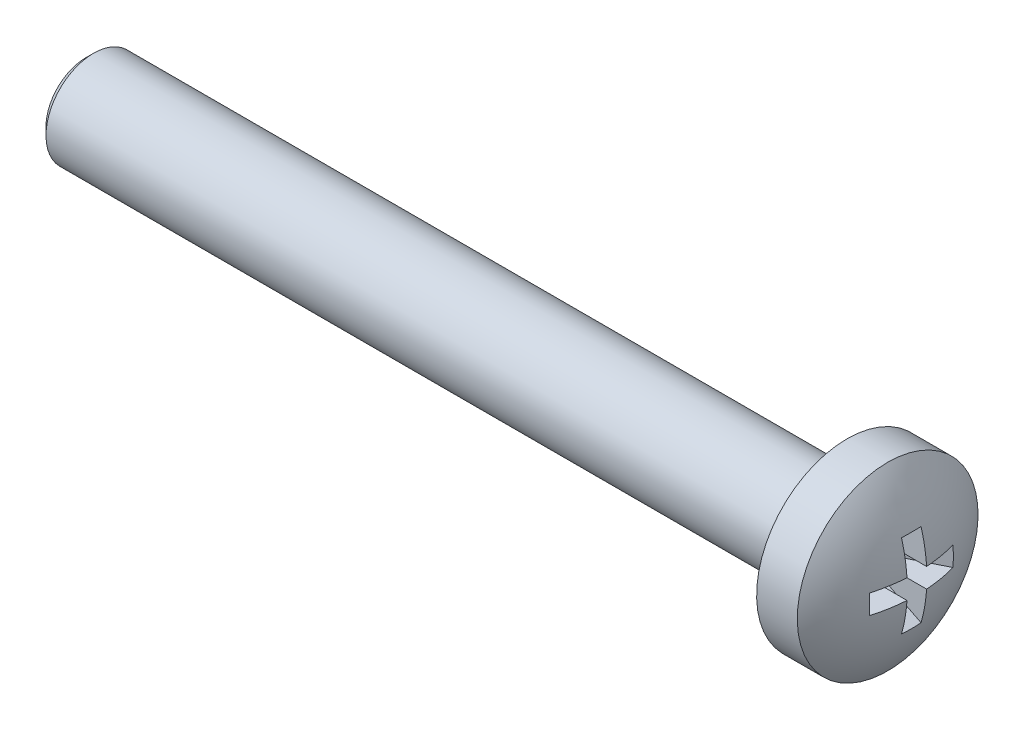
ISO-10303-21;
HEADER;
FILE_DESCRIPTION(('STEP AP214'),'2;1');
FILE_NAME('part.step','',(''),(''),'','','');
FILE_SCHEMA(('AUTOMOTIVE_DESIGN { 1 0 10303 214 1 1 1 1 }'));
ENDSEC;
DATA;
#1=APPLICATION_CONTEXT('core data for automotive mechanical design processes');
#2=APPLICATION_PROTOCOL_DEFINITION('international standard','automotive_design',2000,#1);
#3=PRODUCT_CONTEXT('',#1,'mechanical');
#4=PRODUCT('Part','Part','',(#3));
#5=PRODUCT_RELATED_PRODUCT_CATEGORY('part','',(#4));
#6=PRODUCT_DEFINITION_FORMATION('','',#4);
#7=PRODUCT_DEFINITION_CONTEXT('part definition',#1,'design');
#8=PRODUCT_DEFINITION('design','',#6,#7);
#9=PRODUCT_DEFINITION_SHAPE('','',#8);
#10=(LENGTH_UNIT() NAMED_UNIT(*) SI_UNIT(.MILLI.,.METRE.));
#11=(NAMED_UNIT(*) PLANE_ANGLE_UNIT() SI_UNIT($,.RADIAN.));
#12=(NAMED_UNIT(*) SI_UNIT($,.STERADIAN.) SOLID_ANGLE_UNIT());
#13=UNCERTAINTY_MEASURE_WITH_UNIT(LENGTH_MEASURE(1.E-05),#10,'distance_accuracy_value','');
#14=(GEOMETRIC_REPRESENTATION_CONTEXT(3) GLOBAL_UNCERTAINTY_ASSIGNED_CONTEXT((#13)) GLOBAL_UNIT_ASSIGNED_CONTEXT((#10,
#11,#12)) REPRESENTATION_CONTEXT('',''));
#15=CARTESIAN_POINT('',(0.,0.,0.));
#16=DIRECTION('',(0.,0.,1.));
#17=DIRECTION('',(1.,0.,0.));
#18=AXIS2_PLACEMENT_3D('',#15,#16,#17);
#19=CARTESIAN_POINT('',(-8.00000000000001,0.,0.));
#20=DIRECTION('',(0.999999999999983,0.,0.));
#21=DIRECTION('',(0.,0.999999999999994,0.));
#22=AXIS2_PLACEMENT_3D('',#19,#20,#21);
#23=SPHERICAL_SURFACE('',#22,8.);
#24=CARTESIAN_POINT('',(-7.34565681691368,-1.55431223447522E-12,-1.31240938798616));
#25=DIRECTION('',(0.446197813109793,0.,-0.894934361602041));
#26=DIRECTION('',(-0.894934361602008,0.,-0.446197813109825));
#27=AXIS2_PLACEMENT_3D('',#24,#25,#26);
#28=CIRCLE('',#27,7.86444000530718);
#29=CARTESIAN_POINT('',(-0.322606080628729,0.515000000000931,2.18915454155089));
#30=VERTEX_POINT('',#29);
#31=CARTESIAN_POINT('',(-0.322606080628729,-0.515000000000265,2.18915454155155));
#32=VERTEX_POINT('',#31);
#33=EDGE_CURVE('E230',#30,#32,#28,.T.);
#34=ORIENTED_EDGE('',*,*,#33,.F.);
#35=CARTESIAN_POINT('',(-8.00000000000001,0.514999999998489,-1.33226762955019E-12));
#36=DIRECTION('',(0.,-0.999999999999994,0.));
#37=DIRECTION('',(0.,0.,-1.00000000000002));
#38=AXIS2_PLACEMENT_3D('',#35,#36,#37);
#39=CIRCLE('',#38,7.98340622792051);
#40=CARTESIAN_POINT('',(-0.0332221067735894,0.514999999998544,0.514999999996046));
#41=VERTEX_POINT('',#40);
#42=EDGE_CURVE('E136',#30,#41,#39,.F.);
#43=ORIENTED_EDGE('',*,*,#42,.T.);
#44=CARTESIAN_POINT('',(-8.00000000000001,0.,0.514999999994936));
#45=DIRECTION('',(0.,0.,1.00000000000002));
#46=DIRECTION('',(0.,-0.999999999999994,0.));
#47=AXIS2_PLACEMENT_3D('',#44,#45,#46);
#48=CIRCLE('',#47,7.98340622792051);
#49=CARTESIAN_POINT('',(-0.322606080628729,2.18915454155083,0.51499999999649));
#50=VERTEX_POINT('',#49);
#51=EDGE_CURVE('E168',#50,#41,#48,.F.);
#52=ORIENTED_EDGE('',*,*,#51,.F.);
#53=CARTESIAN_POINT('',(-7.34565681691368,-1.31240938798682,-1.77635683940025E-12));
#54=DIRECTION('',(0.446197813109805,-0.894934361602021,0.));
#55=DIRECTION('',(0.894934361602008,0.446197813109806,0.));
#56=AXIS2_PLACEMENT_3D('',#53,#54,#55);
#57=CIRCLE('',#56,7.86444000530718);
#58=CARTESIAN_POINT('',(-0.322606080628729,2.18915454155189,-0.51500000000293));
#59=VERTEX_POINT('',#58);
#60=EDGE_CURVE('E165',#50,#59,#57,.F.);
#61=ORIENTED_EDGE('',*,*,#60,.T.);
#62=CARTESIAN_POINT('',(-8.00000000000001,0.,-0.515000000003596));
#63=DIRECTION('',(0.,0.,1.00000000000002));
#64=DIRECTION('',(0.,-0.999999999999994,0.));
#65=AXIS2_PLACEMENT_3D('',#62,#63,#64);
#66=CIRCLE('',#65,7.98340622792051);
#67=CARTESIAN_POINT('',(-0.0332221067735894,0.514999999998489,-0.514999999999821));
#68=VERTEX_POINT('',#67);
#69=EDGE_CURVE('E169',#59,#68,#66,.F.);
#70=ORIENTED_EDGE('',*,*,#69,.T.);
#71=CARTESIAN_POINT('',(-8.00000000000001,0.514999999998489,-1.33226762955019E-12));
#72=DIRECTION('',(0.,-0.999999999999994,0.));
#73=DIRECTION('',(0.,0.,-1.00000000000002));
#74=AXIS2_PLACEMENT_3D('',#71,#72,#73);
#75=CIRCLE('',#74,7.98340622792051);
#76=CARTESIAN_POINT('',(-0.322606080628729,0.5149999999991,-2.18915454155399));
#77=VERTEX_POINT('',#76);
#78=EDGE_CURVE('E223',#68,#77,#75,.F.);
#79=ORIENTED_EDGE('',*,*,#78,.T.);
#80=CARTESIAN_POINT('',(-7.34565681691368,-8.88178419700125E-13,1.31240938798483));
#81=DIRECTION('',(0.44619781310981,0.,0.894934361602047));
#82=DIRECTION('',(0.894934361602008,0.,-0.446197813109812));
#83=AXIS2_PLACEMENT_3D('',#80,#81,#82);
#84=CIRCLE('',#83,7.86444000530718);
#85=CARTESIAN_POINT('',(-0.322606080628729,-0.514999999999599,-2.18915454155533));
#86=VERTEX_POINT('',#85);
#87=EDGE_CURVE('E222',#77,#86,#84,.F.);
#88=ORIENTED_EDGE('',*,*,#87,.T.);
#89=CARTESIAN_POINT('',(-8.00000000000001,-0.515000000000099,-1.33226762955019E-12));
#90=DIRECTION('',(0.,-0.999999999999994,0.));
#91=DIRECTION('',(0.,0.,-1.00000000000002));
#92=AXIS2_PLACEMENT_3D('',#89,#90,#91);
#93=CIRCLE('',#92,7.98340622792051);
#94=CARTESIAN_POINT('',(-0.0332221067735894,-0.51499999999971,-0.515000000004262));
#95=VERTEX_POINT('',#94);
#96=EDGE_CURVE('E220',#95,#86,#93,.F.);
#97=ORIENTED_EDGE('',*,*,#96,.F.);
#98=CARTESIAN_POINT('',(-8.00000000000001,0.,-0.515000000003596));
#99=DIRECTION('',(0.,0.,1.00000000000002));
#100=DIRECTION('',(0.,-0.999999999999994,0.));
#101=AXIS2_PLACEMENT_3D('',#98,#99,#100);
#102=CIRCLE('',#101,7.98340622792051);
#103=CARTESIAN_POINT('',(-0.322606080628729,-2.18915454155244,-0.515000000000043));
#104=VERTEX_POINT('',#103);
#105=EDGE_CURVE('E179',#95,#104,#102,.F.);
#106=ORIENTED_EDGE('',*,*,#105,.T.);
#107=CARTESIAN_POINT('',(-7.34565681691368,1.31240938798471,-1.55431223447522E-12));
#108=DIRECTION('',(0.446197813109797,0.894934361602021,0.));
#109=DIRECTION('',(-0.894934361602008,0.446197813109809,0.));
#110=AXIS2_PLACEMENT_3D('',#107,#108,#109);
#111=CIRCLE('',#110,7.86444000530718);
#112=CARTESIAN_POINT('',(-0.322606080628729,-2.18915454155233,0.514999999996713));
#113=VERTEX_POINT('',#112);
#114=EDGE_CURVE('E176',#113,#104,#111,.T.);
#115=ORIENTED_EDGE('',*,*,#114,.F.);
#116=CARTESIAN_POINT('',(-8.00000000000001,0.,0.514999999994936));
#117=DIRECTION('',(0.,0.,1.00000000000002));
#118=DIRECTION('',(0.,-0.999999999999994,0.));
#119=AXIS2_PLACEMENT_3D('',#116,#117,#118);
#120=CIRCLE('',#119,7.98340622792051);
#121=CARTESIAN_POINT('',(-0.0332221067735894,-0.514999999999433,0.514999999997601));
#122=VERTEX_POINT('',#121);
#123=EDGE_CURVE('E180',#122,#113,#120,.F.);
#124=ORIENTED_EDGE('',*,*,#123,.F.);
#125=CARTESIAN_POINT('',(-8.00000000000001,-0.515000000000099,-1.33226762955019E-12));
#126=DIRECTION('',(0.,-0.999999999999994,0.));
#127=DIRECTION('',(0.,0.,-1.00000000000002));
#128=AXIS2_PLACEMENT_3D('',#125,#126,#127);
#129=CIRCLE('',#128,7.98340622792051);
#130=EDGE_CURVE('E215',#32,#122,#129,.F.);
#131=ORIENTED_EDGE('',*,*,#130,.F.);
#132=EDGE_LOOP('',(#34,#43,#52,#61,#70,#79,#88,#97,#106,#115,#124,#131));
#133=FACE_BOUND('',#132,.T.);
#134=CARTESIAN_POINT('',(-1.5628034052082,0.,0.));
#135=DIRECTION('',(0.999999999999983,0.,0.));
#136=DIRECTION('',(0.,0.999999999999994,0.));
#137=AXIS2_PLACEMENT_3D('',#134,#135,#136);
#138=CIRCLE('',#137,4.75);
#139=CARTESIAN_POINT('',(-1.56280340520819,4.74999999999998,0.));
#140=VERTEX_POINT('',#139);
#141=EDGE_CURVE('E140',#140,#140,#138,.T.);
#142=ORIENTED_EDGE('',*,*,#141,.T.);
#143=EDGE_LOOP('',(#142));
#144=FACE_BOUND('',#143,.T.);
#145=ADVANCED_FACE('F38',(#133,#144),#23,.T.);
#146=CARTESIAN_POINT('',(-43.7000000000001,0.,0.));
#147=DIRECTION('',(-0.999999999999983,0.,0.));
#148=DIRECTION('',(0.,-0.999999999999994,0.));
#149=AXIS2_PLACEMENT_3D('',#146,#147,#148);
#150=PLANE('',#149);
#151=CARTESIAN_POINT('',(-43.7000000000001,0.,0.));
#152=DIRECTION('',(-0.999999999999983,0.,0.));
#153=DIRECTION('',(0.,-0.999999999999994,0.));
#154=AXIS2_PLACEMENT_3D('',#151,#152,#153);
#155=CIRCLE('',#154,2.10000000000002);
#156=CARTESIAN_POINT('',(-43.7000000000001,2.09999999999982,0.));
#157=VERTEX_POINT('',#156);
#158=EDGE_CURVE('E11',#157,#157,#155,.T.);
#159=ORIENTED_EDGE('',*,*,#158,.T.);
#160=EDGE_LOOP('',(#159));
#161=FACE_BOUND('',#160,.T.);
#162=ADVANCED_FACE('F282',(#161),#150,.T.);
#163=CARTESIAN_POINT('',(0.,0.,0.));
#164=DIRECTION('',(0.999999999999983,0.,0.));
#165=DIRECTION('',(0.,0.999999999999994,0.));
#166=AXIS2_PLACEMENT_3D('',#163,#164,#165);
#167=CYLINDRICAL_SURFACE('',#166,2.5);
#168=CARTESIAN_POINT('',(-43.2999999999999,0.,0.));
#169=DIRECTION('',(-0.999999999999983,0.,0.));
#170=DIRECTION('',(0.,-0.999999999999994,0.));
#171=AXIS2_PLACEMENT_3D('',#168,#169,#170);
#172=CIRCLE('',#171,2.5);
#173=CARTESIAN_POINT('',(-43.2999999999999,2.5000000000001,-2.81843633553392E-13));
#174=VERTEX_POINT('',#173);
#175=EDGE_CURVE('E48',#174,#174,#172,.F.);
#176=CARTESIAN_POINT('',(-3.70000000000004,0.,0.));
#177=DIRECTION('',(0.999999999999983,0.,0.));
#178=DIRECTION('',(0.,0.999999999999994,0.));
#179=AXIS2_PLACEMENT_3D('',#176,#177,#178);
#180=CIRCLE('',#179,2.5);
#181=CARTESIAN_POINT('',(-3.70000000000003,2.49999999999999,0.));
#182=VERTEX_POINT('',#181);
#183=EDGE_CURVE('E212',#182,#182,#180,.T.);
#184=CARTESIAN_POINT('',(-43.2999999999999,2.5000000000001,-2.81843633553392E-13));
#185=CARTESIAN_POINT('',(-42.8874999999999,2.5000000000001,-2.78908761286407E-13));
#186=CARTESIAN_POINT('',(-42.4749999999999,2.5000000000001,-2.75973889019423E-13));
#187=CARTESIAN_POINT('',(-41.6499999999999,2.5000000000001,-2.70104144485453E-13));
#188=CARTESIAN_POINT('',(-41.2374999999999,2.50000000000009,-2.67169272218468E-13));
#189=CARTESIAN_POINT('',(-40.4124999999999,2.50000000000009,-2.61299527684499E-13));
#190=CARTESIAN_POINT('',(-39.9999999999999,2.50000000000009,-2.58364655417514E-13));
#191=CARTESIAN_POINT('',(-39.1749999999999,2.50000000000009,-2.52494910883544E-13));
#192=CARTESIAN_POINT('',(-38.7624999999999,2.50000000000009,-2.49560038616559E-13));
#193=CARTESIAN_POINT('',(-37.9374999999999,2.50000000000009,-2.4369029408259E-13));
#194=CARTESIAN_POINT('',(-37.5249999999999,2.50000000000008,-2.40755421815605E-13));
#195=CARTESIAN_POINT('',(-36.6999999999999,2.50000000000008,-2.34885677281635E-13));
#196=CARTESIAN_POINT('',(-36.2874999999999,2.50000000000008,-2.31950805014651E-13));
#197=CARTESIAN_POINT('',(-35.4624999999999,2.50000000000008,-2.26081060480681E-13));
#198=CARTESIAN_POINT('',(-35.0499999999999,2.50000000000008,-2.23146188213696E-13));
#199=CARTESIAN_POINT('',(-34.2249999999999,2.50000000000008,-2.17276443679727E-13));
#200=CARTESIAN_POINT('',(-33.8124999999999,2.50000000000007,-2.14341571412742E-13));
#201=CARTESIAN_POINT('',(-32.9874999999999,2.50000000000007,-2.08471826878772E-13));
#202=CARTESIAN_POINT('',(-32.5749999999999,2.50000000000007,-2.05536954611787E-13));
#203=CARTESIAN_POINT('',(-31.7499999999999,2.50000000000007,-1.99667210077818E-13));
#204=CARTESIAN_POINT('',(-31.3374999999999,2.50000000000007,-1.96732337810833E-13));
#205=CARTESIAN_POINT('',(-30.5124999999999,2.50000000000007,-1.90862593276864E-13));
#206=CARTESIAN_POINT('',(-30.0999999999999,2.50000000000006,-1.87927721009879E-13));
#207=CARTESIAN_POINT('',(-29.2749999999999,2.50000000000006,-1.82057976475909E-13));
#208=CARTESIAN_POINT('',(-28.8624999999999,2.50000000000006,-1.79123104208924E-13));
#209=CARTESIAN_POINT('',(-28.0374999999999,2.50000000000006,-1.73253359674955E-13));
#210=CARTESIAN_POINT('',(-27.625,2.50000000000006,-1.7031848740797E-13));
#211=CARTESIAN_POINT('',(-26.8,2.50000000000006,-1.64448742874E-13));
#212=CARTESIAN_POINT('',(-26.3875,2.50000000000005,-1.61513870607016E-13));
#213=CARTESIAN_POINT('',(-25.5625,2.50000000000005,-1.55644126073046E-13));
#214=CARTESIAN_POINT('',(-25.15,2.50000000000005,-1.52709253806061E-13));
#215=CARTESIAN_POINT('',(-24.325,2.50000000000005,-1.46839509272092E-13));
#216=CARTESIAN_POINT('',(-23.9125,2.50000000000005,-1.43904637005107E-13));
#217=CARTESIAN_POINT('',(-23.0875,2.50000000000005,-1.38034892471137E-13));
#218=CARTESIAN_POINT('',(-22.675,2.50000000000005,-1.35100020204153E-13));
#219=CARTESIAN_POINT('',(-21.85,2.50000000000004,-1.29230275670183E-13));
#220=CARTESIAN_POINT('',(-21.4375,2.50000000000004,-1.26295403403198E-13));
#221=CARTESIAN_POINT('',(-20.6125,2.50000000000004,-1.20425658869229E-13));
#222=CARTESIAN_POINT('',(-20.2,2.50000000000004,-1.17490786602244E-13));
#223=CARTESIAN_POINT('',(-19.375,2.50000000000004,-1.11621042068274E-13));
#224=CARTESIAN_POINT('',(-18.9625,2.50000000000004,-1.08686169801289E-13));
#225=CARTESIAN_POINT('',(-18.1375,2.50000000000003,-1.0281642526732E-13));
#226=CARTESIAN_POINT('',(-17.725,2.50000000000003,0.));
#227=CARTESIAN_POINT('',(-16.9,2.50000000000003,0.));
#228=CARTESIAN_POINT('',(-16.4875,2.50000000000003,0.));
#229=CARTESIAN_POINT('',(-15.6625,2.50000000000003,0.));
#230=CARTESIAN_POINT('',(-15.25,2.50000000000003,0.));
#231=CARTESIAN_POINT('',(-14.425,2.50000000000002,0.));
#232=CARTESIAN_POINT('',(-14.0125,2.50000000000002,0.));
#233=CARTESIAN_POINT('',(-13.1875,2.50000000000002,0.));
#234=CARTESIAN_POINT('',(-12.775,2.50000000000002,0.));
#235=CARTESIAN_POINT('',(-11.95,2.50000000000002,0.));
#236=CARTESIAN_POINT('',(-11.5375,2.50000000000002,0.));
#237=CARTESIAN_POINT('',(-10.7125,2.50000000000001,0.));
#238=CARTESIAN_POINT('',(-10.3,2.50000000000001,0.));
#239=CARTESIAN_POINT('',(-9.47500000000001,2.50000000000001,0.));
#240=CARTESIAN_POINT('',(-9.06250000000001,2.50000000000001,0.));
#241=CARTESIAN_POINT('',(-8.23750000000001,2.50000000000001,0.));
#242=CARTESIAN_POINT('',(-7.82500000000001,2.50000000000001,0.));
#243=CARTESIAN_POINT('',(-7.00000000000002,2.5,0.));
#244=CARTESIAN_POINT('',(-6.58750000000002,2.5,0.));
#245=CARTESIAN_POINT('',(-5.76250000000002,2.5,0.));
#246=CARTESIAN_POINT('',(-5.35000000000002,2.5,0.));
#247=CARTESIAN_POINT('',(-4.52500000000003,2.5,0.));
#248=CARTESIAN_POINT('',(-4.11250000000003,2.5,0.));
#249=CARTESIAN_POINT('',(-3.70000000000003,2.49999999999999,0.));
#250=B_SPLINE_CURVE_WITH_KNOTS('',3,(#184,#185,#186,#187,#188,#189,#190,#191,#192,#193,#194,
#195,#196,#197,#198,#199,#200,#201,#202,#203,#204,#205,#206,#207,#208,#209,#210,#211,#212,#213,
#214,#215,#216,#217,#218,#219,#220,#221,#222,#223,#224,#225,#226,#227,#228,#229,#230,#231,#232,
#233,#234,#235,#236,#237,#238,#239,#240,#241,#242,#243,#244,#245,#246,#247,#248,#249),
.UNSPECIFIED.,.F.,.F.,(4,2,2,2,2,2,2,2,2,2,2,2,2,2,2,2,2,2,2,2,2,2,2,2,2,2,2,2,2,2,2,2,4),(0.,
1.2375,2.47499999999999,3.71249999999999,4.94999999999998,6.18749999999997,7.42499999999997,
8.66249999999997,9.89999999999996,11.1375,12.375,13.6125,14.8499999999999,16.0874999999999,
17.3249999999999,18.5624999999999,19.7999999999999,21.0374999999999,22.2749999999999,
23.5124999999999,24.7499999999999,25.9874999999999,27.2249999999999,28.4624999999999,
29.6999999999999,30.9374999999999,32.1749999999999,33.4124999999999,34.6499999999999,
35.8874999999999,37.1249999999999,38.3624999999999,39.5999999999999),.UNSPECIFIED.);
#251=EDGE_CURVE('BSEAM287',#174,#182,#250,.T.);
#252=ORIENTED_EDGE('',*,*,#175,.T.);
#253=ORIENTED_EDGE('',*,*,#183,.F.);
#254=ORIENTED_EDGE('',*,*,#251,.T.);
#255=ORIENTED_EDGE('',*,*,#251,.F.);
#256=EDGE_LOOP('',(#252,#254,#253,#255));
#257=FACE_BOUND('',#256,.T.);
#258=ADVANCED_FACE('F287',(#257),#167,.T.);
#259=CARTESIAN_POINT('',(-3.70000000000004,2.49999999999834,-2.22044604925031E-13));
#260=DIRECTION('',(-0.999999999999983,0.,0.));
#261=DIRECTION('',(0.,-0.999999999999994,0.));
#262=AXIS2_PLACEMENT_3D('',#259,#260,#261);
#263=PLANE('',#262);
#264=ORIENTED_EDGE('',*,*,#183,.T.);
#265=EDGE_LOOP('',(#264));
#266=FACE_BOUND('',#265,.T.);
#267=CARTESIAN_POINT('',(-3.70000000000004,0.,0.));
#268=DIRECTION('',(0.999999999999983,0.,0.));
#269=DIRECTION('',(0.,0.999999999999994,0.));
#270=AXIS2_PLACEMENT_3D('',#267,#268,#269);
#271=CIRCLE('',#270,4.75);
#272=CARTESIAN_POINT('',(-3.70000000000002,4.74999999999998,0.));
#273=VERTEX_POINT('',#272);
#274=EDGE_CURVE('E209',#273,#273,#271,.T.);
#275=ORIENTED_EDGE('',*,*,#274,.F.);
#276=EDGE_LOOP('',(#275));
#277=FACE_BOUND('',#276,.T.);
#278=ADVANCED_FACE('F316',(#266,#277),#263,.T.);
#279=CARTESIAN_POINT('',(0.,0.,0.));
#280=DIRECTION('',(0.999999999999983,0.,0.));
#281=DIRECTION('',(0.,0.999999999999994,0.));
#282=AXIS2_PLACEMENT_3D('',#279,#280,#281);
#283=CYLINDRICAL_SURFACE('',#282,4.75);
#284=CARTESIAN_POINT('',(-3.70000000000002,4.74999999999998,0.));
#285=CARTESIAN_POINT('',(-3.67773753547094,4.74999999999998,0.));
#286=CARTESIAN_POINT('',(-3.65547507094186,4.74999999999998,0.));
#287=CARTESIAN_POINT('',(-3.6109501418837,4.74999999999998,0.));
#288=CARTESIAN_POINT('',(-3.58868767735462,4.74999999999998,0.));
#289=CARTESIAN_POINT('',(-3.54416274829645,4.74999999999998,0.));
#290=CARTESIAN_POINT('',(-3.52190028376737,4.74999999999998,0.));
#291=CARTESIAN_POINT('',(-3.47737535470921,4.74999999999998,0.));
#292=CARTESIAN_POINT('',(-3.45511289018013,4.74999999999998,0.));
#293=CARTESIAN_POINT('',(-3.41058796112196,4.74999999999998,0.));
#294=CARTESIAN_POINT('',(-3.38832549659288,4.74999999999998,0.));
#295=CARTESIAN_POINT('',(-3.34380056753472,4.74999999999998,0.));
#296=CARTESIAN_POINT('',(-3.32153810300564,4.74999999999998,0.));
#297=CARTESIAN_POINT('',(-3.27701317394747,4.74999999999998,0.));
#298=CARTESIAN_POINT('',(-3.25475070941839,4.74999999999998,0.));
#299=CARTESIAN_POINT('',(-3.21022578036023,4.74999999999998,0.));
#300=CARTESIAN_POINT('',(-3.18796331583115,4.74999999999998,0.));
#301=CARTESIAN_POINT('',(-3.14343838677298,4.74999999999998,0.));
#302=CARTESIAN_POINT('',(-3.1211759222439,4.74999999999998,0.));
#303=CARTESIAN_POINT('',(-3.07665099318574,4.74999999999998,0.));
#304=CARTESIAN_POINT('',(-3.05438852865666,4.74999999999998,0.));
#305=CARTESIAN_POINT('',(-3.00986359959849,4.74999999999998,0.));
#306=CARTESIAN_POINT('',(-2.98760113506941,4.74999999999998,0.));
#307=CARTESIAN_POINT('',(-2.94307620601125,4.74999999999998,0.));
#308=CARTESIAN_POINT('',(-2.92081374148217,4.74999999999998,0.));
#309=CARTESIAN_POINT('',(-2.876288812424,4.74999999999998,0.));
#310=CARTESIAN_POINT('',(-2.85402634789492,4.74999999999998,0.));
#311=CARTESIAN_POINT('',(-2.80950141883676,4.74999999999998,0.));
#312=CARTESIAN_POINT('',(-2.78723895430768,4.74999999999998,0.));
#313=CARTESIAN_POINT('',(-2.74271402524951,4.74999999999998,0.));
#314=CARTESIAN_POINT('',(-2.72045156072043,4.74999999999998,0.));
#315=CARTESIAN_POINT('',(-2.67592663166227,4.74999999999998,0.));
#316=CARTESIAN_POINT('',(-2.65366416713319,4.74999999999998,0.));
#317=CARTESIAN_POINT('',(-2.60913923807503,4.74999999999998,0.));
#318=CARTESIAN_POINT('',(-2.58687677354594,4.74999999999998,0.));
#319=CARTESIAN_POINT('',(-2.54235184448778,4.74999999999998,0.));
#320=CARTESIAN_POINT('',(-2.5200893799587,4.74999999999998,0.));
#321=CARTESIAN_POINT('',(-2.47556445090054,4.74999999999998,0.));
#322=CARTESIAN_POINT('',(-2.45330198637145,4.74999999999998,0.));
#323=CARTESIAN_POINT('',(-2.40877705731329,4.74999999999998,0.));
#324=CARTESIAN_POINT('',(-2.38651459278421,4.74999999999998,0.));
#325=CARTESIAN_POINT('',(-2.34198966372605,4.74999999999998,0.));
#326=CARTESIAN_POINT('',(-2.31972719919696,4.74999999999998,0.));
#327=CARTESIAN_POINT('',(-2.2752022701388,4.74999999999998,0.));
#328=CARTESIAN_POINT('',(-2.25293980560972,4.74999999999998,0.));
#329=CARTESIAN_POINT('',(-2.20841487655156,4.74999999999998,0.));
#330=CARTESIAN_POINT('',(-2.18615241202248,4.74999999999998,0.));
#331=CARTESIAN_POINT('',(-2.14162748296431,4.74999999999998,0.));
#332=CARTESIAN_POINT('',(-2.11936501843523,4.74999999999998,0.));
#333=CARTESIAN_POINT('',(-2.07484008937707,4.74999999999998,0.));
#334=CARTESIAN_POINT('',(-2.05257762484798,4.74999999999998,0.));
#335=CARTESIAN_POINT('',(-2.00805269578982,4.74999999999998,0.));
#336=CARTESIAN_POINT('',(-1.98579023126074,4.74999999999998,0.));
#337=CARTESIAN_POINT('',(-1.94126530220258,4.74999999999998,0.));
#338=CARTESIAN_POINT('',(-1.9190028376735,4.74999999999998,0.));
#339=CARTESIAN_POINT('',(-1.87447790861533,4.74999999999998,0.));
#340=CARTESIAN_POINT('',(-1.85221544408625,4.74999999999998,0.));
#341=CARTESIAN_POINT('',(-1.80769051502809,4.74999999999998,0.));
#342=CARTESIAN_POINT('',(-1.78542805049901,4.74999999999998,0.));
#343=CARTESIAN_POINT('',(-1.74090312144084,4.74999999999998,0.));
#344=CARTESIAN_POINT('',(-1.71864065691176,4.74999999999998,0.));
#345=CARTESIAN_POINT('',(-1.6741157278536,4.74999999999998,0.));
#346=CARTESIAN_POINT('',(-1.65185326332452,4.74999999999998,0.));
#347=CARTESIAN_POINT('',(-1.60732833426635,4.74999999999998,0.));
#348=CARTESIAN_POINT('',(-1.58506586973727,4.74999999999998,0.));
#349=CARTESIAN_POINT('',(-1.56280340520819,4.74999999999998,0.));
#350=B_SPLINE_CURVE_WITH_KNOTS('',3,(#284,#285,#286,#287,#288,#289,#290,#291,#292,#293,#294,
#295,#296,#297,#298,#299,#300,#301,#302,#303,#304,#305,#306,#307,#308,#309,#310,#311,#312,#313,
#314,#315,#316,#317,#318,#319,#320,#321,#322,#323,#324,#325,#326,#327,#328,#329,#330,#331,#332,
#333,#334,#335,#336,#337,#338,#339,#340,#341,#342,#343,#344,#345,#346,#347,#348,#349),
.UNSPECIFIED.,.F.,.F.,(4,2,2,2,2,2,2,2,2,2,2,2,2,2,2,2,2,2,2,2,2,2,2,2,2,2,2,2,2,2,2,2,4),(0.,
0.0667873935872448,0.13357478717449,0.200362180761735,0.267149574348979,0.333936967936224,
0.400724361523469,0.467511755110714,0.534299148697959,0.601086542285204,0.667873935872448,
0.734661329459693,0.801448723046938,0.868236116634183,0.935023510221428,1.00181090380867,
1.06859829739592,1.13538569098316,1.20217308457041,1.26896047815765,1.3357478717449,
1.40253526533214,1.46932265891939,1.53611005250663,1.60289744609388,1.66968483968112,
1.73647223326837,1.80325962685561,1.87004702044286,1.9368344140301,2.00362180761735,
2.07040920120459,2.13719659479184),.UNSPECIFIED.);
#351=EDGE_CURVE('BSEAM313',#273,#140,#350,.T.);
#352=ORIENTED_EDGE('',*,*,#274,.T.);
#353=ORIENTED_EDGE('',*,*,#141,.F.);
#354=ORIENTED_EDGE('',*,*,#351,.T.);
#355=ORIENTED_EDGE('',*,*,#351,.F.);
#356=EDGE_LOOP('',(#352,#354,#353,#355));
#357=FACE_BOUND('',#356,.T.);
#358=ADVANCED_FACE('F313',(#357),#283,.T.);
#359=CARTESIAN_POINT('',(0.,1.11022302462516E-13,2.3500000000003));
#360=DIRECTION('',(0.446197813109793,0.,-0.894934361602041));
#361=DIRECTION('',(-0.894934361602008,0.,-0.446197813109825));
#362=AXIS2_PLACEMENT_3D('',#359,#360,#361);
#363=PLANE('',#362);
#364=ORIENTED_EDGE('',*,*,#33,.T.);
#365=DIRECTION('',(-0.894934361602008,0.,-0.446197813109825));
#366=VECTOR('',#365,1.);
#367=CARTESIAN_POINT('',(0.,-0.515000000000598,2.34999999999719));
#368=LINE('',#367,#366);
#369=CARTESIAN_POINT('',(-2.73999999999996,-0.515000000000265,0.98388639393221));
#370=VERTEX_POINT('',#369);
#371=EDGE_CURVE('E57',#370,#32,#368,.F.);
#372=ORIENTED_EDGE('',*,*,#371,.F.);
#373=DIRECTION('',(0.,0.999999999999994,0.));
#374=VECTOR('',#373,1.);
#375=CARTESIAN_POINT('',(-2.73999999999996,-7.21644966006352E-13,0.983886393934652));
#376=LINE('',#375,#374);
#377=CARTESIAN_POINT('',(-2.73999999999996,0.514999999999932,0.983886393928435));
#378=VERTEX_POINT('',#377);
#379=EDGE_CURVE('E148',#378,#370,#376,.F.);
#380=ORIENTED_EDGE('',*,*,#379,.F.);
#381=DIRECTION('',(-0.894934361602008,0.,-0.446197813109825));
#382=VECTOR('',#381,1.);
#383=CARTESIAN_POINT('',(0.,0.515000000000487,2.34999999999652));
#384=LINE('',#383,#382);
#385=EDGE_CURVE('E129',#378,#30,#384,.F.);
#386=ORIENTED_EDGE('',*,*,#385,.T.);
#387=EDGE_LOOP('',(#364,#372,#380,#386));
#388=FACE_BOUND('',#387,.T.);
#389=ADVANCED_FACE('F40',(#388),#363,.T.);
#390=CARTESIAN_POINT('',(-2.73999999999996,0.514999999998489,-1.33226762955019E-12));
#391=DIRECTION('',(0.,-0.999999999999994,0.));
#392=DIRECTION('',(0.,0.,-1.00000000000002));
#393=AXIS2_PLACEMENT_3D('',#390,#391,#392);
#394=PLANE('',#393);
#395=ORIENTED_EDGE('',*,*,#385,.F.);
#396=DIRECTION('',(0.,0.,-1.00000000000002));
#397=VECTOR('',#396,1.);
#398=CARTESIAN_POINT('',(-2.73999999999996,0.514999999998489,-1.33226762955019E-12));
#399=LINE('',#398,#397);
#400=CARTESIAN_POINT('',(-2.73999999999996,0.514999999998544,0.514999999996046));
#401=VERTEX_POINT('',#400);
#402=EDGE_CURVE('E133',#378,#401,#399,.T.);
#403=ORIENTED_EDGE('',*,*,#402,.T.);
#404=DIRECTION('',(0.999999999999983,0.,0.));
#405=VECTOR('',#404,1.);
#406=CARTESIAN_POINT('',(-2.73999999999996,0.514999999998544,0.514999999996046));
#407=LINE('',#406,#405);
#408=EDGE_CURVE('E141',#401,#41,#407,.T.);
#409=ORIENTED_EDGE('',*,*,#408,.T.);
#410=ORIENTED_EDGE('',*,*,#42,.F.);
#411=EDGE_LOOP('',(#395,#403,#409,#410));
#412=FACE_BOUND('',#411,.T.);
#413=ADVANCED_FACE('F131',(#412),#394,.T.);
#414=CARTESIAN_POINT('',(-2.73999999999996,0.,0.514999999997157));
#415=DIRECTION('',(0.,0.,1.00000000000002));
#416=DIRECTION('',(0.,-0.999999999999994,0.));
#417=AXIS2_PLACEMENT_3D('',#414,#415,#416);
#418=PLANE('',#417);
#419=ORIENTED_EDGE('',*,*,#51,.T.);
#420=ORIENTED_EDGE('',*,*,#408,.F.);
#421=DIRECTION('',(0.,-0.999999999999994,0.));
#422=VECTOR('',#421,1.);
#423=CARTESIAN_POINT('',(-2.73999999999996,0.,0.514999999997157));
#424=LINE('',#423,#422);
#425=CARTESIAN_POINT('',(-2.73999999999996,0.983886393934152,0.514999999999599));
#426=VERTEX_POINT('',#425);
#427=EDGE_CURVE('E151',#426,#401,#424,.T.);
#428=ORIENTED_EDGE('',*,*,#427,.F.);
#429=DIRECTION('',(0.894934361602008,0.446197813109806,0.));
#430=VECTOR('',#429,1.);
#431=CARTESIAN_POINT('',(-3.13288330602379,0.788002003438537,0.514999999998933));
#432=LINE('',#431,#430);
#433=EDGE_CURVE('E161',#426,#50,#432,.T.);
#434=ORIENTED_EDGE('',*,*,#433,.T.);
#435=EDGE_LOOP('',(#419,#420,#428,#434));
#436=FACE_BOUND('',#435,.T.);
#437=ADVANCED_FACE('F272',(#436),#418,.F.);
#438=CARTESIAN_POINT('',(0.,2.34999999999946,-1.77635683940025E-12));
#439=DIRECTION('',(0.446197813109805,-0.894934361602021,0.));
#440=DIRECTION('',(0.894934361602008,0.446197813109806,0.));
#441=AXIS2_PLACEMENT_3D('',#438,#439,#440);
#442=PLANE('',#441);
#443=ORIENTED_EDGE('',*,*,#433,.F.);
#444=DIRECTION('',(0.,0.,-1.00000000000002));
#445=VECTOR('',#444,1.);
#446=CARTESIAN_POINT('',(-2.73999999999996,0.983886393931876,-4.44089209850063E-13));
#447=LINE('',#446,#445);
#448=CARTESIAN_POINT('',(-2.73999999999996,0.983886393933764,-0.515000000004484));
#449=VERTEX_POINT('',#448);
#450=EDGE_CURVE('E173',#426,#449,#447,.T.);
#451=ORIENTED_EDGE('',*,*,#450,.T.);
#452=DIRECTION('',(0.894934361602008,0.446197813109806,0.));
#453=VECTOR('',#452,1.);
#454=CARTESIAN_POINT('',(-3.13288330602379,0.788002003437871,-0.515000000002486));
#455=LINE('',#454,#453);
#456=EDGE_CURVE('E164',#449,#59,#455,.T.);
#457=ORIENTED_EDGE('',*,*,#456,.T.);
#458=ORIENTED_EDGE('',*,*,#60,.F.);
#459=EDGE_LOOP('',(#443,#451,#457,#458));
#460=FACE_BOUND('',#459,.T.);
#461=ADVANCED_FACE('F270',(#460),#442,.T.);
#462=CARTESIAN_POINT('',(-2.73999999999996,-4.44089209850063E-13,-0.515000000001153));
#463=DIRECTION('',(0.,0.,1.00000000000002));
#464=DIRECTION('',(0.,-0.999999999999994,0.));
#465=AXIS2_PLACEMENT_3D('',#462,#463,#464);
#466=PLANE('',#465);
#467=ORIENTED_EDGE('',*,*,#456,.F.);
#468=DIRECTION('',(0.,-0.999999999999994,0.));
#469=VECTOR('',#468,1.);
#470=CARTESIAN_POINT('',(-2.73999999999996,-4.44089209850063E-13,-0.515000000001153));
#471=LINE('',#470,#469);
#472=CARTESIAN_POINT('',(-2.73999999999996,0.514999999998489,-0.514999999999821));
#473=VERTEX_POINT('',#472);
#474=EDGE_CURVE('E175',#449,#473,#471,.T.);
#475=ORIENTED_EDGE('',*,*,#474,.T.);
#476=DIRECTION('',(0.999999999999983,0.,0.));
#477=VECTOR('',#476,1.);
#478=CARTESIAN_POINT('',(-2.73999999999996,0.514999999998489,-0.514999999999821));
#479=LINE('',#478,#477);
#480=EDGE_CURVE('E172',#473,#68,#479,.T.);
#481=ORIENTED_EDGE('',*,*,#480,.T.);
#482=ORIENTED_EDGE('',*,*,#69,.F.);
#483=EDGE_LOOP('',(#467,#475,#481,#482));
#484=FACE_BOUND('',#483,.T.);
#485=ADVANCED_FACE('F267',(#484),#466,.T.);
#486=CARTESIAN_POINT('',(-2.73999999999996,0.514999999998489,-1.33226762955019E-12));
#487=DIRECTION('',(0.,-0.999999999999994,0.));
#488=DIRECTION('',(0.,0.,-1.00000000000002));
#489=AXIS2_PLACEMENT_3D('',#486,#487,#488);
#490=PLANE('',#489);
#491=ORIENTED_EDGE('',*,*,#480,.F.);
#492=DIRECTION('',(0.,0.,-1.00000000000002));
#493=VECTOR('',#492,1.);
#494=CARTESIAN_POINT('',(-2.73999999999996,0.514999999998489,-1.33226762955019E-12));
#495=LINE('',#494,#493);
#496=CARTESIAN_POINT('',(-2.73999999999996,0.514999999999599,-0.983886393935762));
#497=VERTEX_POINT('',#496);
#498=EDGE_CURVE('E195',#473,#497,#495,.T.);
#499=ORIENTED_EDGE('',*,*,#498,.T.);
#500=DIRECTION('',(0.894934361602008,0.,-0.446197813109812));
#501=VECTOR('',#500,1.);
#502=CARTESIAN_POINT('',(0.,0.514999999997545,-2.3500000000034));
#503=LINE('',#502,#501);
#504=EDGE_CURVE('E202',#497,#77,#503,.T.);
#505=ORIENTED_EDGE('',*,*,#504,.T.);
#506=ORIENTED_EDGE('',*,*,#78,.F.);
#507=EDGE_LOOP('',(#491,#499,#505,#506));
#508=FACE_BOUND('',#507,.T.);
#509=ADVANCED_FACE('F264',(#508),#490,.T.);
#510=CARTESIAN_POINT('',(0.,-1.0547118733939E-12,-2.34999999999985));
#511=DIRECTION('',(0.44619781310981,0.,0.894934361602047));
#512=DIRECTION('',(0.894934361602008,0.,-0.446197813109812));
#513=AXIS2_PLACEMENT_3D('',#510,#511,#512);
#514=PLANE('',#513);
#515=ORIENTED_EDGE('',*,*,#504,.F.);
#516=DIRECTION('',(0.,-0.999999999999994,0.));
#517=VECTOR('',#516,1.);
#518=CARTESIAN_POINT('',(-2.73999999999996,-9.99200722162641E-13,-0.983886393932654));
#519=LINE('',#518,#517);
#520=CARTESIAN_POINT('',(-2.73999999999996,-0.515000000001264,-0.98388639393443));
#521=VERTEX_POINT('',#520);
#522=EDGE_CURVE('E194',#497,#521,#519,.T.);
#523=ORIENTED_EDGE('',*,*,#522,.T.);
#524=DIRECTION('',(0.894934361602008,0.,-0.446197813109812));
#525=VECTOR('',#524,1.);
#526=CARTESIAN_POINT('',(0.,-0.515000000001042,-2.34999999999941));
#527=LINE('',#526,#525);
#528=EDGE_CURVE('E204',#521,#86,#527,.T.);
#529=ORIENTED_EDGE('',*,*,#528,.T.);
#530=ORIENTED_EDGE('',*,*,#87,.F.);
#531=EDGE_LOOP('',(#515,#523,#529,#530));
#532=FACE_BOUND('',#531,.T.);
#533=ADVANCED_FACE('F258',(#532),#514,.T.);
#534=CARTESIAN_POINT('',(-2.73999999999996,-0.514999999999488,-2.22044604925031E-12));
#535=DIRECTION('',(0.,-0.999999999999994,0.));
#536=DIRECTION('',(0.,0.,-1.00000000000002));
#537=AXIS2_PLACEMENT_3D('',#534,#535,#536);
#538=PLANE('',#537);
#539=ORIENTED_EDGE('',*,*,#96,.T.);
#540=ORIENTED_EDGE('',*,*,#528,.F.);
#541=DIRECTION('',(0.,0.,-1.00000000000002));
#542=VECTOR('',#541,1.);
#543=CARTESIAN_POINT('',(-2.73999999999996,-0.514999999999488,-2.22044604925031E-12));
#544=LINE('',#543,#542);
#545=CARTESIAN_POINT('',(-2.73999999999996,-0.514999999999599,-0.515000000000931));
#546=VERTEX_POINT('',#545);
#547=EDGE_CURVE('E187',#546,#521,#544,.T.);
#548=ORIENTED_EDGE('',*,*,#547,.F.);
#549=DIRECTION('',(0.999999999999983,0.,0.));
#550=VECTOR('',#549,1.);
#551=CARTESIAN_POINT('',(-2.73999999999996,-0.514999999999599,-0.515000000000931));
#552=LINE('',#551,#550);
#553=EDGE_CURVE('E101',#546,#95,#552,.T.);
#554=ORIENTED_EDGE('',*,*,#553,.T.);
#555=EDGE_LOOP('',(#539,#540,#548,#554));
#556=FACE_BOUND('',#555,.T.);
#557=ADVANCED_FACE('F254',(#556),#538,.F.);
#558=CARTESIAN_POINT('',(-2.73999999999996,-4.44089209850063E-13,-0.515000000001153));
#559=DIRECTION('',(0.,0.,1.00000000000002));
#560=DIRECTION('',(0.,-0.999999999999994,0.));
#561=AXIS2_PLACEMENT_3D('',#558,#559,#560);
#562=PLANE('',#561);
#563=ORIENTED_EDGE('',*,*,#553,.F.);
#564=DIRECTION('',(0.,-0.999999999999994,0.));
#565=VECTOR('',#564,1.);
#566=CARTESIAN_POINT('',(-2.73999999999996,-4.44089209850063E-13,-0.515000000001153));
#567=LINE('',#566,#565);
#568=CARTESIAN_POINT('',(-2.73999999999996,-0.983886393933542,-0.515000000005594));
#569=VERTEX_POINT('',#568);
#570=EDGE_CURVE('E95',#546,#569,#567,.T.);
#571=ORIENTED_EDGE('',*,*,#570,.T.);
#572=DIRECTION('',(-0.894934361602008,0.446197813109809,0.));
#573=VECTOR('',#572,1.);
#574=CARTESIAN_POINT('',(-3.13288330602379,-0.788002003439925,-0.515000000003596));
#575=LINE('',#574,#573);
#576=EDGE_CURVE('E42',#569,#104,#575,.F.);
#577=ORIENTED_EDGE('',*,*,#576,.T.);
#578=ORIENTED_EDGE('',*,*,#105,.F.);
#579=EDGE_LOOP('',(#563,#571,#577,#578));
#580=FACE_BOUND('',#579,.T.);
#581=ADVANCED_FACE('F250',(#580),#562,.T.);
#582=CARTESIAN_POINT('',(0.,-2.35000000000024,0.));
#583=DIRECTION('',(0.446197813109797,0.894934361602021,0.));
#584=DIRECTION('',(-0.894934361602008,0.446197813109809,0.));
#585=AXIS2_PLACEMENT_3D('',#582,#583,#584);
#586=PLANE('',#585);
#587=ORIENTED_EDGE('',*,*,#114,.T.);
#588=ORIENTED_EDGE('',*,*,#576,.F.);
#589=DIRECTION('',(0.,0.,1.00000000000002));
#590=VECTOR('',#589,1.);
#591=CARTESIAN_POINT('',(-2.73999999999996,-0.983886393935096,-4.21884749357559E-12));
#592=LINE('',#591,#590);
#593=CARTESIAN_POINT('',(-2.73999999999996,-0.983886393934263,0.514999999998711));
#594=VERTEX_POINT('',#593);
#595=EDGE_CURVE('E183',#594,#569,#592,.F.);
#596=ORIENTED_EDGE('',*,*,#595,.F.);
#597=DIRECTION('',(-0.894934361602008,0.446197813109809,0.));
#598=VECTOR('',#597,1.);
#599=CARTESIAN_POINT('',(-3.13288330602379,-0.788002003440424,0.515000000000043));
#600=LINE('',#599,#598);
#601=EDGE_CURVE('E181',#594,#113,#600,.F.);
#602=ORIENTED_EDGE('',*,*,#601,.T.);
#603=EDGE_LOOP('',(#587,#588,#596,#602));
#604=FACE_BOUND('',#603,.T.);
#605=ADVANCED_FACE('F249',(#604),#586,.T.);
#606=CARTESIAN_POINT('',(-2.73999999999996,0.,0.514999999997157));
#607=DIRECTION('',(0.,0.,1.00000000000002));
#608=DIRECTION('',(0.,-0.999999999999994,0.));
#609=AXIS2_PLACEMENT_3D('',#606,#607,#608);
#610=PLANE('',#609);
#611=ORIENTED_EDGE('',*,*,#123,.T.);
#612=ORIENTED_EDGE('',*,*,#601,.F.);
#613=DIRECTION('',(0.,-0.999999999999994,0.));
#614=VECTOR('',#613,1.);
#615=CARTESIAN_POINT('',(-2.73999999999996,0.,0.514999999997157));
#616=LINE('',#615,#614);
#617=CARTESIAN_POINT('',(-2.73999999999996,-0.514999999999433,0.514999999997601));
#618=VERTEX_POINT('',#617);
#619=EDGE_CURVE('E155',#618,#594,#616,.T.);
#620=ORIENTED_EDGE('',*,*,#619,.F.);
#621=DIRECTION('',(0.999999999999983,0.,0.));
#622=VECTOR('',#621,1.);
#623=CARTESIAN_POINT('',(-2.73999999999996,-0.514999999999433,0.514999999997601));
#624=LINE('',#623,#622);
#625=EDGE_CURVE('E160',#618,#122,#624,.T.);
#626=ORIENTED_EDGE('',*,*,#625,.T.);
#627=EDGE_LOOP('',(#611,#612,#620,#626));
#628=FACE_BOUND('',#627,.T.);
#629=ADVANCED_FACE('F247',(#628),#610,.F.);
#630=CARTESIAN_POINT('',(-2.73999999999996,-0.514999999999488,-2.22044604925031E-12));
#631=DIRECTION('',(0.,-0.999999999999994,0.));
#632=DIRECTION('',(0.,0.,-1.00000000000002));
#633=AXIS2_PLACEMENT_3D('',#630,#631,#632);
#634=PLANE('',#633);
#635=ORIENTED_EDGE('',*,*,#130,.T.);
#636=ORIENTED_EDGE('',*,*,#625,.F.);
#637=DIRECTION('',(0.,0.,-1.00000000000002));
#638=VECTOR('',#637,1.);
#639=CARTESIAN_POINT('',(-2.73999999999996,-0.514999999999488,-2.22044604925031E-12));
#640=LINE('',#639,#638);
#641=EDGE_CURVE('E153',#370,#618,#640,.T.);
#642=ORIENTED_EDGE('',*,*,#641,.F.);
#643=ORIENTED_EDGE('',*,*,#371,.T.);
#644=EDGE_LOOP('',(#635,#636,#642,#643));
#645=FACE_BOUND('',#644,.T.);
#646=ADVANCED_FACE('F245',(#645),#634,.F.);
#647=CARTESIAN_POINT('',(-2.73999999999996,0.,0.));
#648=DIRECTION('',(0.999999999999983,0.,0.));
#649=DIRECTION('',(0.,0.,-1.00000000000002));
#650=AXIS2_PLACEMENT_3D('',#647,#648,#649);
#651=PLANE('',#650);
#652=ORIENTED_EDGE('',*,*,#379,.T.);
#653=ORIENTED_EDGE('',*,*,#641,.T.);
#654=ORIENTED_EDGE('',*,*,#619,.T.);
#655=ORIENTED_EDGE('',*,*,#595,.T.);
#656=ORIENTED_EDGE('',*,*,#570,.F.);
#657=ORIENTED_EDGE('',*,*,#547,.T.);
#658=ORIENTED_EDGE('',*,*,#522,.F.);
#659=ORIENTED_EDGE('',*,*,#498,.F.);
#660=ORIENTED_EDGE('',*,*,#474,.F.);
#661=ORIENTED_EDGE('',*,*,#450,.F.);
#662=ORIENTED_EDGE('',*,*,#427,.T.);
#663=ORIENTED_EDGE('',*,*,#402,.F.);
#664=EDGE_LOOP('',(#652,#653,#654,#655,#656,#657,#658,#659,#660,#661,#662,#663));
#665=FACE_BOUND('',#664,.T.);
#666=ADVANCED_FACE('F146',(#665),#651,.T.);
#667=CARTESIAN_POINT('',(-43.2999999999999,0.,0.));
#668=DIRECTION('',(0.999999999999983,0.,0.));
#669=DIRECTION('',(0.,0.999999999999994,0.));
#670=AXIS2_PLACEMENT_3D('',#667,#668,#669);
#671=CONICAL_SURFACE('',#670,2.5,0.78539816339744);
#672=CARTESIAN_POINT('',(-43.7000000000001,2.09999999999982,0.));
#673=CARTESIAN_POINT('',(-43.6958333333334,2.10416666666648,0.));
#674=CARTESIAN_POINT('',(-43.6916666666667,2.10833333333315,0.));
#675=CARTESIAN_POINT('',(-43.6833333333334,2.11666666666649,0.));
#676=CARTESIAN_POINT('',(-43.6791666666667,2.12083333333316,0.));
#677=CARTESIAN_POINT('',(-43.6708333333334,2.1291666666665,0.));
#678=CARTESIAN_POINT('',(-43.6666666666667,2.13333333333317,0.));
#679=CARTESIAN_POINT('',(-43.6583333333334,2.1416666666665,0.));
#680=CARTESIAN_POINT('',(-43.6541666666667,2.14583333333317,0.));
#681=CARTESIAN_POINT('',(-43.6458333333334,2.15416666666651,0.));
#682=CARTESIAN_POINT('',(-43.6416666666667,2.15833333333318,0.));
#683=CARTESIAN_POINT('',(-43.6333333333334,2.16666666666652,0.));
#684=CARTESIAN_POINT('',(-43.6291666666667,2.17083333333318,0.));
#685=CARTESIAN_POINT('',(-43.6208333333334,2.17916666666652,0.));
#686=CARTESIAN_POINT('',(-43.6166666666667,2.18333333333319,0.));
#687=CARTESIAN_POINT('',(-43.6083333333334,2.19166666666653,0.));
#688=CARTESIAN_POINT('',(-43.6041666666667,2.1958333333332,0.));
#689=CARTESIAN_POINT('',(-43.5958333333334,2.20416666666653,0.));
#690=CARTESIAN_POINT('',(-43.5916666666667,2.2083333333332,0.));
#691=CARTESIAN_POINT('',(-43.5833333333333,2.21666666666654,0.));
#692=CARTESIAN_POINT('',(-43.5791666666667,2.22083333333321,0.));
#693=CARTESIAN_POINT('',(-43.5708333333333,2.22916666666654,0.));
#694=CARTESIAN_POINT('',(-43.5666666666667,2.23333333333321,0.));
#695=CARTESIAN_POINT('',(-43.5583333333333,2.24166666666655,0.));
#696=CARTESIAN_POINT('',(-43.5541666666667,2.24583333333322,0.));
#697=CARTESIAN_POINT('',(-43.5458333333333,2.25416666666656,0.));
#698=CARTESIAN_POINT('',(-43.5416666666667,2.25833333333322,0.));
#699=CARTESIAN_POINT('',(-43.5333333333333,2.26666666666656,0.));
#700=CARTESIAN_POINT('',(-43.5291666666667,2.27083333333323,0.));
#701=CARTESIAN_POINT('',(-43.5208333333333,2.27916666666657,0.));
#702=CARTESIAN_POINT('',(-43.5166666666667,2.28333333333323,0.));
#703=CARTESIAN_POINT('',(-43.5083333333333,2.29166666666657,0.));
#704=CARTESIAN_POINT('',(-43.5041666666666,2.29583333333324,0.));
#705=CARTESIAN_POINT('',(-43.4958333333333,2.30416666666658,0.));
#706=CARTESIAN_POINT('',(-43.4916666666666,2.30833333333324,0.));
#707=CARTESIAN_POINT('',(-43.4833333333333,2.31666666666658,0.));
#708=CARTESIAN_POINT('',(-43.4791666666666,2.32083333333325,0.));
#709=CARTESIAN_POINT('',(-43.4708333333333,2.32916666666659,0.));
#710=CARTESIAN_POINT('',(-43.4666666666666,2.33333333333326,0.));
#711=CARTESIAN_POINT('',(-43.4583333333333,2.34166666666659,0.));
#712=CARTESIAN_POINT('',(-43.4541666666666,2.34583333333326,0.));
#713=CARTESIAN_POINT('',(-43.4458333333333,2.3541666666666,0.));
#714=CARTESIAN_POINT('',(-43.4416666666666,2.35833333333327,0.));
#715=CARTESIAN_POINT('',(-43.4333333333333,2.3666666666666,0.));
#716=CARTESIAN_POINT('',(-43.4291666666666,2.37083333333327,0.));
#717=CARTESIAN_POINT('',(-43.4208333333333,2.37916666666661,0.));
#718=CARTESIAN_POINT('',(-43.4166666666666,2.38333333333328,0.));
#719=CARTESIAN_POINT('',(-43.4083333333333,2.39166666666661,0.));
#720=CARTESIAN_POINT('',(-43.4041666666666,2.39583333333328,0.));
#721=CARTESIAN_POINT('',(-43.3958333333333,2.40416666666662,0.));
#722=CARTESIAN_POINT('',(-43.3916666666666,2.40833333333329,0.));
#723=CARTESIAN_POINT('',(-43.3833333333333,2.41666666666663,0.));
#724=CARTESIAN_POINT('',(-43.3791666666666,2.42083333333329,0.));
#725=CARTESIAN_POINT('',(-43.3708333333333,2.42916666666663,0.));
#726=CARTESIAN_POINT('',(-43.3666666666666,2.4333333333333,0.));
#727=CARTESIAN_POINT('',(-43.3583333333333,2.44166666666664,0.));
#728=CARTESIAN_POINT('',(-43.3541666666666,2.4458333333333,0.));
#729=CARTESIAN_POINT('',(-43.3458333333333,2.45416666666664,0.));
#730=CARTESIAN_POINT('',(-43.3416666666666,2.45833333333331,0.));
#731=CARTESIAN_POINT('',(-43.3333333333332,2.46666666666665,0.));
#732=CARTESIAN_POINT('',(-43.3291666666666,2.47083333333332,0.));
#733=CARTESIAN_POINT('',(-43.3208333333332,2.47916666666665,0.));
#734=CARTESIAN_POINT('',(-43.3166666666666,2.48333333333332,0.));
#735=CARTESIAN_POINT('',(-43.3083333333332,2.49166666666666,0.));
#736=CARTESIAN_POINT('',(-43.3041666666666,2.49583333333333,0.));
#737=CARTESIAN_POINT('',(-43.2999999999999,2.5,0.));
#738=B_SPLINE_CURVE_WITH_KNOTS('',3,(#672,#673,#674,#675,#676,#677,#678,#679,#680,#681,#682,
#683,#684,#685,#686,#687,#688,#689,#690,#691,#692,#693,#694,#695,#696,#697,#698,#699,#700,#701,
#702,#703,#704,#705,#706,#707,#708,#709,#710,#711,#712,#713,#714,#715,#716,#717,#718,#719,#720,
#721,#722,#723,#724,#725,#726,#727,#728,#729,#730,#731,#732,#733,#734,#735,#736,#737),
.UNSPECIFIED.,.F.,.F.,(4,2,2,2,2,2,2,2,2,2,2,2,2,2,2,2,2,2,2,2,2,2,2,2,2,2,2,2,2,2,2,2,4),(0.,
0.0176776695296762,0.0353553390593428,0.0530330085890193,0.0707106781186859,0.0883883476483627,
0.106066017178034,0.123743686707705,0.141421356237377,0.159099025767049,0.17677669529672,
0.194454364826392,0.212132034356058,0.229809703885734,0.247487373415401,0.265165042945077,
0.282842712474744,0.30052038200442,0.318198051534087,0.335875721063763,0.353553390593435,
0.371231060123106,0.388908729652778,0.406586399182449,0.424264068712116,0.441941738241787,
0.459619407771459,0.47729707730113,0.494974746830802,0.512652416360473,0.530330085890145,
0.548007755419816,0.565685424949487),.UNSPECIFIED.);
#739=EDGE_CURVE('BSEAM292',#157,#174,#738,.T.);
#740=ORIENTED_EDGE('',*,*,#158,.F.);
#741=ORIENTED_EDGE('',*,*,#175,.F.);
#742=ORIENTED_EDGE('',*,*,#739,.T.);
#743=ORIENTED_EDGE('',*,*,#739,.F.);
#744=EDGE_LOOP('',(#740,#742,#741,#743));
#745=FACE_BOUND('',#744,.T.);
#746=ADVANCED_FACE('F292',(#745),#671,.T.);
#747=CLOSED_SHELL('',(#145,#162,#258,#278,#358,#389,#413,#437,#461,#485,#509,#533,#557,#581,
#605,#629,#646,#666,#746));
#748=MANIFOLD_SOLID_BREP('B2',#747);
#749=ADVANCED_BREP_SHAPE_REPRESENTATION('',(#18,#748),#14);
#750=SHAPE_DEFINITION_REPRESENTATION(#9,#749);
ENDSEC;
END-ISO-10303-21;
